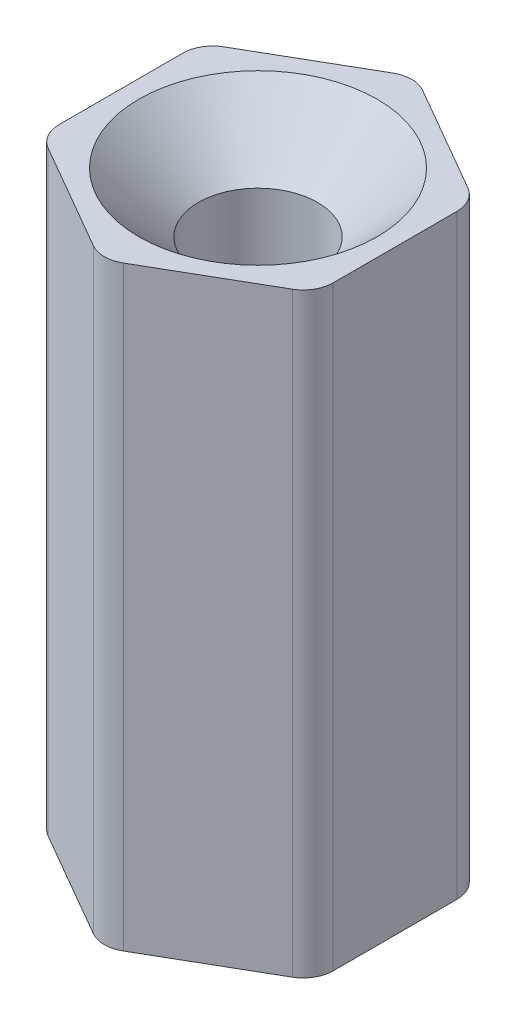
ISO-10303-21;
HEADER;
FILE_DESCRIPTION(('STEP AP214'),'2;1');
FILE_NAME('part.step','',(''),(''),'','','');
FILE_SCHEMA(('AUTOMOTIVE_DESIGN { 1 0 10303 214 1 1 1 1 }'));
ENDSEC;
DATA;
#1=APPLICATION_CONTEXT('core data for automotive mechanical design processes');
#2=APPLICATION_PROTOCOL_DEFINITION('international standard','automotive_design',2000,#1);
#3=PRODUCT_CONTEXT('',#1,'mechanical');
#4=PRODUCT('Part','Part','',(#3));
#5=PRODUCT_RELATED_PRODUCT_CATEGORY('part','',(#4));
#6=PRODUCT_DEFINITION_FORMATION('','',#4);
#7=PRODUCT_DEFINITION_CONTEXT('part definition',#1,'design');
#8=PRODUCT_DEFINITION('design','',#6,#7);
#9=PRODUCT_DEFINITION_SHAPE('','',#8);
#10=(LENGTH_UNIT() NAMED_UNIT(*) SI_UNIT(.MILLI.,.METRE.));
#11=(NAMED_UNIT(*) PLANE_ANGLE_UNIT() SI_UNIT($,.RADIAN.));
#12=(NAMED_UNIT(*) SI_UNIT($,.STERADIAN.) SOLID_ANGLE_UNIT());
#13=UNCERTAINTY_MEASURE_WITH_UNIT(LENGTH_MEASURE(1.E-05),#10,'distance_accuracy_value','');
#14=(GEOMETRIC_REPRESENTATION_CONTEXT(3) GLOBAL_UNCERTAINTY_ASSIGNED_CONTEXT((#13)) GLOBAL_UNIT_ASSIGNED_CONTEXT((#10,
#11,#12)) REPRESENTATION_CONTEXT('',''));
#15=CARTESIAN_POINT('',(0.,0.,0.));
#16=DIRECTION('',(0.,0.,1.));
#17=DIRECTION('',(1.,0.,0.));
#18=AXIS2_PLACEMENT_3D('',#15,#16,#17);
#19=CARTESIAN_POINT('',(2.29999999999999,10.,-1.32790561913617));
#20=DIRECTION('',(-0.499999999999995,0.,0.866025403784442));
#21=DIRECTION('',(0.866025403784442,0.,0.499999999999995));
#22=AXIS2_PLACEMENT_3D('',#19,#20,#21);
#23=PLANE('',#22);
#24=DIRECTION('',(-0.866025403784442,0.,-0.499999999999995));
#25=VECTOR('',#24,1.);
#26=CARTESIAN_POINT('',(2.29999999999999,0.,-1.32790561913617));
#27=LINE('',#26,#25);
#28=CARTESIAN_POINT('',(2.04999999999999,0.,-1.47224318643357));
#29=VERTEX_POINT('',#28);
#30=CARTESIAN_POINT('',(0.249999999999999,0.,-2.51147367097488));
#31=VERTEX_POINT('',#30);
#32=EDGE_CURVE('E212',#29,#31,#27,.T.);
#33=ORIENTED_EDGE('',*,*,#32,.T.);
#34=DIRECTION('',(0.,-1.,0.));
#35=VECTOR('',#34,1.);
#36=CARTESIAN_POINT('',(0.249999999999999,10.,-2.51147367097488));
#37=LINE('',#36,#35);
#38=CARTESIAN_POINT('',(0.249999999999999,10.,-2.51147367097488));
#39=VERTEX_POINT('',#38);
#40=EDGE_CURVE('E205',#31,#39,#37,.F.);
#41=ORIENTED_EDGE('',*,*,#40,.T.);
#42=DIRECTION('',(-0.866025403784442,0.,-0.499999999999995));
#43=VECTOR('',#42,1.);
#44=CARTESIAN_POINT('',(2.29999999999999,10.,-1.32790561913617));
#45=LINE('',#44,#43);
#46=CARTESIAN_POINT('',(2.04999999999999,10.,-1.47224318643357));
#47=VERTEX_POINT('',#46);
#48=EDGE_CURVE('E150',#47,#39,#45,.T.);
#49=ORIENTED_EDGE('',*,*,#48,.F.);
#50=DIRECTION('',(0.,-1.,0.));
#51=VECTOR('',#50,1.);
#52=CARTESIAN_POINT('',(2.04999999999999,10.,-1.47224318643357));
#53=LINE('',#52,#51);
#54=EDGE_CURVE('E202',#47,#29,#53,.T.);
#55=ORIENTED_EDGE('',*,*,#54,.T.);
#56=EDGE_LOOP('',(#33,#41,#49,#55));
#57=FACE_BOUND('',#56,.T.);
#58=ADVANCED_FACE('F33',(#57),#23,.F.);
#59=CARTESIAN_POINT('',(0.,10.,-2.65581123827228));
#60=DIRECTION('',(0.500000000000001,0.,0.866025403784438));
#61=DIRECTION('',(0.866025403784438,0.,-0.500000000000001));
#62=AXIS2_PLACEMENT_3D('',#59,#60,#61);
#63=PLANE('',#62);
#64=DIRECTION('',(-0.866025403784438,0.,0.500000000000001));
#65=VECTOR('',#64,1.);
#66=CARTESIAN_POINT('',(0.,0.,-2.65581123827228));
#67=LINE('',#66,#65);
#68=CARTESIAN_POINT('',(-0.249999999999998,0.,-2.51147367097488));
#69=VERTEX_POINT('',#68);
#70=CARTESIAN_POINT('',(-2.05000000000001,0.,-1.47224318643354));
#71=VERTEX_POINT('',#70);
#72=EDGE_CURVE('E236',#69,#71,#67,.T.);
#73=ORIENTED_EDGE('',*,*,#72,.T.);
#74=DIRECTION('',(0.,-1.,0.));
#75=VECTOR('',#74,1.);
#76=CARTESIAN_POINT('',(-2.05,10.,-1.47224318643354));
#77=LINE('',#76,#75);
#78=CARTESIAN_POINT('',(-2.05000000000001,10.,-1.47224318643354));
#79=VERTEX_POINT('',#78);
#80=EDGE_CURVE('E200',#71,#79,#77,.F.);
#81=ORIENTED_EDGE('',*,*,#80,.T.);
#82=DIRECTION('',(-0.866025403784438,0.,0.500000000000001));
#83=VECTOR('',#82,1.);
#84=CARTESIAN_POINT('',(0.,10.,-2.65581123827228));
#85=LINE('',#84,#83);
#86=CARTESIAN_POINT('',(-0.249999999999998,10.,-2.51147367097488));
#87=VERTEX_POINT('',#86);
#88=EDGE_CURVE('E222',#87,#79,#85,.T.);
#89=ORIENTED_EDGE('',*,*,#88,.F.);
#90=DIRECTION('',(0.,-1.,0.));
#91=VECTOR('',#90,1.);
#92=CARTESIAN_POINT('',(-0.249999999999998,10.,-2.51147367097488));
#93=LINE('',#92,#91);
#94=EDGE_CURVE('E197',#87,#69,#93,.T.);
#95=ORIENTED_EDGE('',*,*,#94,.T.);
#96=EDGE_LOOP('',(#73,#81,#89,#95));
#97=FACE_BOUND('',#96,.T.);
#98=ADVANCED_FACE('F260',(#97),#63,.F.);
#99=CARTESIAN_POINT('',(-2.30000000000001,10.,-1.32790561913614));
#100=DIRECTION('',(1.,0.,0.));
#101=DIRECTION('',(0.,0.,-1.));
#102=AXIS2_PLACEMENT_3D('',#99,#100,#101);
#103=PLANE('',#102);
#104=DIRECTION('',(0.,0.,1.));
#105=VECTOR('',#104,1.);
#106=CARTESIAN_POINT('',(-2.30000000000001,0.,-1.32790561913614));
#107=LINE('',#106,#105);
#108=CARTESIAN_POINT('',(-2.3,0.,-1.03923048454132));
#109=VERTEX_POINT('',#108);
#110=CARTESIAN_POINT('',(-2.3,0.,1.03923048454134));
#111=VERTEX_POINT('',#110);
#112=EDGE_CURVE('E152',#109,#111,#107,.T.);
#113=ORIENTED_EDGE('',*,*,#112,.T.);
#114=DIRECTION('',(0.,-1.,0.));
#115=VECTOR('',#114,1.);
#116=CARTESIAN_POINT('',(-2.3,10.,1.03923048454134));
#117=LINE('',#116,#115);
#118=CARTESIAN_POINT('',(-2.3,10.,1.03923048454134));
#119=VERTEX_POINT('',#118);
#120=EDGE_CURVE('E195',#111,#119,#117,.F.);
#121=ORIENTED_EDGE('',*,*,#120,.T.);
#122=DIRECTION('',(0.,0.,1.));
#123=VECTOR('',#122,1.);
#124=CARTESIAN_POINT('',(-2.30000000000001,10.,-1.32790561913614));
#125=LINE('',#124,#123);
#126=CARTESIAN_POINT('',(-2.3,10.,-1.03923048454132));
#127=VERTEX_POINT('',#126);
#128=EDGE_CURVE('E225',#127,#119,#125,.T.);
#129=ORIENTED_EDGE('',*,*,#128,.F.);
#130=DIRECTION('',(0.,-1.,0.));
#131=VECTOR('',#130,1.);
#132=CARTESIAN_POINT('',(-2.3,10.,-1.03923048454132));
#133=LINE('',#132,#131);
#134=EDGE_CURVE('E192',#127,#109,#133,.T.);
#135=ORIENTED_EDGE('',*,*,#134,.T.);
#136=EDGE_LOOP('',(#113,#121,#129,#135));
#137=FACE_BOUND('',#136,.T.);
#138=ADVANCED_FACE('F242',(#137),#103,.F.);
#139=CARTESIAN_POINT('',(-2.3,10.,1.32790561913615));
#140=DIRECTION('',(0.499999999999995,0.,-0.866025403784442));
#141=DIRECTION('',(-0.866025403784442,0.,-0.499999999999995));
#142=AXIS2_PLACEMENT_3D('',#139,#140,#141);
#143=PLANE('',#142);
#144=DIRECTION('',(0.866025403784442,0.,0.499999999999995));
#145=VECTOR('',#144,1.);
#146=CARTESIAN_POINT('',(-2.3,0.,1.32790561913615));
#147=LINE('',#146,#145);
#148=CARTESIAN_POINT('',(-2.04999999999999,0.,1.47224318643356));
#149=VERTEX_POINT('',#148);
#150=CARTESIAN_POINT('',(-0.249999999999982,0.,2.51147367097488));
#151=VERTEX_POINT('',#150);
#152=EDGE_CURVE('E148',#149,#151,#147,.T.);
#153=ORIENTED_EDGE('',*,*,#152,.T.);
#154=DIRECTION('',(0.,-1.,0.));
#155=VECTOR('',#154,1.);
#156=CARTESIAN_POINT('',(-0.249999999999983,10.,2.51147367097488));
#157=LINE('',#156,#155);
#158=CARTESIAN_POINT('',(-0.249999999999982,10.,2.51147367097488));
#159=VERTEX_POINT('',#158);
#160=EDGE_CURVE('E127',#151,#159,#157,.F.);
#161=ORIENTED_EDGE('',*,*,#160,.T.);
#162=DIRECTION('',(0.866025403784442,0.,0.499999999999995));
#163=VECTOR('',#162,1.);
#164=CARTESIAN_POINT('',(-2.3,10.,1.32790561913615));
#165=LINE('',#164,#163);
#166=CARTESIAN_POINT('',(-2.04999999999999,10.,1.47224318643356));
#167=VERTEX_POINT('',#166);
#168=EDGE_CURVE('E230',#167,#159,#165,.T.);
#169=ORIENTED_EDGE('',*,*,#168,.F.);
#170=DIRECTION('',(0.,-1.,0.));
#171=VECTOR('',#170,1.);
#172=CARTESIAN_POINT('',(-2.04999999999999,10.,1.47224318643356));
#173=LINE('',#172,#171);
#174=EDGE_CURVE('E132',#167,#149,#173,.T.);
#175=ORIENTED_EDGE('',*,*,#174,.T.);
#176=EDGE_LOOP('',(#153,#161,#169,#175));
#177=FACE_BOUND('',#176,.T.);
#178=ADVANCED_FACE('F252',(#177),#143,.F.);
#179=CARTESIAN_POINT('',(0.,10.,2.65581123827228));
#180=DIRECTION('',(-0.500000000000007,0.,-0.866025403784434));
#181=DIRECTION('',(-0.866025403784435,0.,0.500000000000007));
#182=AXIS2_PLACEMENT_3D('',#179,#180,#181);
#183=PLANE('',#182);
#184=DIRECTION('',(0.866025403784435,0.,-0.500000000000007));
#185=VECTOR('',#184,1.);
#186=CARTESIAN_POINT('',(0.,10.,2.65581123827228));
#187=LINE('',#186,#185);
#188=CARTESIAN_POINT('',(0.250000000000018,10.,2.51147367097487));
#189=VERTEX_POINT('',#188);
#190=CARTESIAN_POINT('',(2.05000000000001,10.,1.47224318643353));
#191=VERTEX_POINT('',#190);
#192=EDGE_CURVE('E141',#189,#191,#187,.T.);
#193=ORIENTED_EDGE('',*,*,#192,.F.);
#194=DIRECTION('',(0.,-1.,0.));
#195=VECTOR('',#194,1.);
#196=CARTESIAN_POINT('',(0.250000000000018,10.,2.51147367097487));
#197=LINE('',#196,#195);
#198=CARTESIAN_POINT('',(0.250000000000018,0.,2.51147367097487));
#199=VERTEX_POINT('',#198);
#200=EDGE_CURVE('E126',#189,#199,#197,.T.);
#201=ORIENTED_EDGE('',*,*,#200,.T.);
#202=DIRECTION('',(0.866025403784435,0.,-0.500000000000007));
#203=VECTOR('',#202,1.);
#204=CARTESIAN_POINT('',(0.,0.,2.65581123827228));
#205=LINE('',#204,#203);
#206=CARTESIAN_POINT('',(2.05000000000001,0.,1.47224318643353));
#207=VERTEX_POINT('',#206);
#208=EDGE_CURVE('E139',#199,#207,#205,.T.);
#209=ORIENTED_EDGE('',*,*,#208,.T.);
#210=DIRECTION('',(0.,-1.,0.));
#211=VECTOR('',#210,1.);
#212=CARTESIAN_POINT('',(2.05000000000001,10.,1.47224318643353));
#213=LINE('',#212,#211);
#214=EDGE_CURVE('E143',#207,#191,#213,.F.);
#215=ORIENTED_EDGE('',*,*,#214,.T.);
#216=EDGE_LOOP('',(#193,#201,#209,#215));
#217=FACE_BOUND('',#216,.T.);
#218=ADVANCED_FACE('F138',(#217),#183,.F.);
#219=CARTESIAN_POINT('',(2.30000000000001,10.,1.32790561913612));
#220=DIRECTION('',(-1.,0.,0.));
#221=DIRECTION('',(0.,0.,1.));
#222=AXIS2_PLACEMENT_3D('',#219,#220,#221);
#223=PLANE('',#222);
#224=DIRECTION('',(0.,0.,-1.));
#225=VECTOR('',#224,1.);
#226=CARTESIAN_POINT('',(2.30000000000001,0.,1.32790561913612));
#227=LINE('',#226,#225);
#228=CARTESIAN_POINT('',(2.30000000000001,0.,1.03923048454131));
#229=VERTEX_POINT('',#228);
#230=CARTESIAN_POINT('',(2.29999999999999,0.,-1.03923048454136));
#231=VERTEX_POINT('',#230);
#232=EDGE_CURVE('E147',#229,#231,#227,.T.);
#233=ORIENTED_EDGE('',*,*,#232,.T.);
#234=DIRECTION('',(0.,-1.,0.));
#235=VECTOR('',#234,1.);
#236=CARTESIAN_POINT('',(2.29999999999999,10.,-1.03923048454136));
#237=LINE('',#236,#235);
#238=CARTESIAN_POINT('',(2.29999999999999,10.,-1.03923048454136));
#239=VERTEX_POINT('',#238);
#240=EDGE_CURVE('E11',#231,#239,#237,.F.);
#241=ORIENTED_EDGE('',*,*,#240,.T.);
#242=DIRECTION('',(0.,0.,-1.));
#243=VECTOR('',#242,1.);
#244=CARTESIAN_POINT('',(2.30000000000001,10.,1.32790561913612));
#245=LINE('',#244,#243);
#246=CARTESIAN_POINT('',(2.30000000000001,10.,1.03923048454131));
#247=VERTEX_POINT('',#246);
#248=EDGE_CURVE('E160',#247,#239,#245,.T.);
#249=ORIENTED_EDGE('',*,*,#248,.F.);
#250=DIRECTION('',(0.,-1.,0.));
#251=VECTOR('',#250,1.);
#252=CARTESIAN_POINT('',(2.30000000000001,10.,1.03923048454131));
#253=LINE('',#252,#251);
#254=EDGE_CURVE('E41',#247,#229,#253,.T.);
#255=ORIENTED_EDGE('',*,*,#254,.T.);
#256=EDGE_LOOP('',(#233,#241,#249,#255));
#257=FACE_BOUND('',#256,.T.);
#258=ADVANCED_FACE('F208',(#257),#223,.F.);
#259=CARTESIAN_POINT('',(0.,10.,0.));
#260=DIRECTION('',(0.,1.,0.));
#261=DIRECTION('',(0.,0.,1.));
#262=AXIS2_PLACEMENT_3D('',#259,#260,#261);
#263=PLANE('',#262);
#264=CARTESIAN_POINT('',(0.,10.,0.));
#265=DIRECTION('',(0.,1.,0.));
#266=DIRECTION('',(0.,0.,1.));
#267=AXIS2_PLACEMENT_3D('',#264,#265,#266);
#268=CIRCLE('',#267,2.);
#269=CARTESIAN_POINT('',(0.,10.,2.));
#270=VERTEX_POINT('',#269);
#271=EDGE_CURVE('E166',#270,#270,#268,.F.);
#272=ORIENTED_EDGE('',*,*,#271,.T.);
#273=EDGE_LOOP('',(#272));
#274=FACE_BOUND('',#273,.T.);
#275=ORIENTED_EDGE('',*,*,#168,.T.);
#276=CARTESIAN_POINT('',(0.,10.,2.07846096908265));
#277=DIRECTION('',(0.,1.,0.));
#278=DIRECTION('',(0.,0.,1.));
#279=AXIS2_PLACEMENT_3D('',#276,#277,#278);
#280=CIRCLE('',#279,0.5);
#281=EDGE_CURVE('E190',#159,#189,#280,.T.);
#282=ORIENTED_EDGE('',*,*,#281,.T.);
#283=ORIENTED_EDGE('',*,*,#192,.T.);
#284=CARTESIAN_POINT('',(1.80000000000001,10.,1.03923048454131));
#285=DIRECTION('',(0.,1.,0.));
#286=DIRECTION('',(0.,0.,1.));
#287=AXIS2_PLACEMENT_3D('',#284,#285,#286);
#288=CIRCLE('',#287,0.5);
#289=EDGE_CURVE('E53',#191,#247,#288,.T.);
#290=ORIENTED_EDGE('',*,*,#289,.T.);
#291=ORIENTED_EDGE('',*,*,#248,.T.);
#292=CARTESIAN_POINT('',(1.79999999999999,10.,-1.03923048454135));
#293=DIRECTION('',(0.,1.,0.));
#294=DIRECTION('',(0.,0.,1.));
#295=AXIS2_PLACEMENT_3D('',#292,#293,#294);
#296=CIRCLE('',#295,0.5);
#297=EDGE_CURVE('E182',#239,#47,#296,.T.);
#298=ORIENTED_EDGE('',*,*,#297,.T.);
#299=ORIENTED_EDGE('',*,*,#48,.T.);
#300=CARTESIAN_POINT('',(0.,10.,-2.07846096908266));
#301=DIRECTION('',(0.,1.,0.));
#302=DIRECTION('',(0.,0.,1.));
#303=AXIS2_PLACEMENT_3D('',#300,#301,#302);
#304=CIRCLE('',#303,0.5);
#305=EDGE_CURVE('E184',#39,#87,#304,.T.);
#306=ORIENTED_EDGE('',*,*,#305,.T.);
#307=ORIENTED_EDGE('',*,*,#88,.T.);
#308=CARTESIAN_POINT('',(-1.8,10.,-1.03923048454132));
#309=DIRECTION('',(0.,1.,0.));
#310=DIRECTION('',(0.,0.,1.));
#311=AXIS2_PLACEMENT_3D('',#308,#309,#310);
#312=CIRCLE('',#311,0.5);
#313=EDGE_CURVE('E186',#79,#127,#312,.T.);
#314=ORIENTED_EDGE('',*,*,#313,.T.);
#315=ORIENTED_EDGE('',*,*,#128,.T.);
#316=CARTESIAN_POINT('',(-1.8,10.,1.03923048454134));
#317=DIRECTION('',(0.,1.,0.));
#318=DIRECTION('',(0.,0.,1.));
#319=AXIS2_PLACEMENT_3D('',#316,#317,#318);
#320=CIRCLE('',#319,0.5);
#321=EDGE_CURVE('E188',#119,#167,#320,.T.);
#322=ORIENTED_EDGE('',*,*,#321,.T.);
#323=EDGE_LOOP('',(#275,#282,#283,#290,#291,#298,#299,#306,#307,#314,#315,#322));
#324=FACE_BOUND('',#323,.T.);
#325=ADVANCED_FACE('F250',(#274,#324),#263,.T.);
#326=CARTESIAN_POINT('',(0.,0.,0.));
#327=DIRECTION('',(0.,1.,0.));
#328=DIRECTION('',(0.,0.,1.));
#329=AXIS2_PLACEMENT_3D('',#326,#327,#328);
#330=PLANE('',#329);
#331=CARTESIAN_POINT('',(0.,0.,0.));
#332=DIRECTION('',(0.,1.,0.));
#333=DIRECTION('',(0.,0.,1.));
#334=AXIS2_PLACEMENT_3D('',#331,#332,#333);
#335=CIRCLE('',#334,2.);
#336=CARTESIAN_POINT('',(0.,0.,2.));
#337=VERTEX_POINT('',#336);
#338=EDGE_CURVE('E156',#337,#337,#335,.T.);
#339=ORIENTED_EDGE('',*,*,#338,.T.);
#340=EDGE_LOOP('',(#339));
#341=FACE_BOUND('',#340,.T.);
#342=ORIENTED_EDGE('',*,*,#208,.F.);
#343=CARTESIAN_POINT('',(0.,0.,2.07846096908265));
#344=DIRECTION('',(0.,1.,0.));
#345=DIRECTION('',(0.,0.,1.));
#346=AXIS2_PLACEMENT_3D('',#343,#344,#345);
#347=CIRCLE('',#346,0.5);
#348=EDGE_CURVE('E122',#199,#151,#347,.F.);
#349=ORIENTED_EDGE('',*,*,#348,.T.);
#350=ORIENTED_EDGE('',*,*,#152,.F.);
#351=CARTESIAN_POINT('',(-1.8,0.,1.03923048454134));
#352=DIRECTION('',(0.,1.,0.));
#353=DIRECTION('',(0.,0.,1.));
#354=AXIS2_PLACEMENT_3D('',#351,#352,#353);
#355=CIRCLE('',#354,0.5);
#356=EDGE_CURVE('E133',#149,#111,#355,.F.);
#357=ORIENTED_EDGE('',*,*,#356,.T.);
#358=ORIENTED_EDGE('',*,*,#112,.F.);
#359=CARTESIAN_POINT('',(-1.8,0.,-1.03923048454132));
#360=DIRECTION('',(0.,1.,0.));
#361=DIRECTION('',(0.,0.,1.));
#362=AXIS2_PLACEMENT_3D('',#359,#360,#361);
#363=CIRCLE('',#362,0.5);
#364=EDGE_CURVE('E175',#109,#71,#363,.F.);
#365=ORIENTED_EDGE('',*,*,#364,.T.);
#366=ORIENTED_EDGE('',*,*,#72,.F.);
#367=CARTESIAN_POINT('',(0.,0.,-2.07846096908266));
#368=DIRECTION('',(0.,1.,0.));
#369=DIRECTION('',(0.,0.,1.));
#370=AXIS2_PLACEMENT_3D('',#367,#368,#369);
#371=CIRCLE('',#370,0.5);
#372=EDGE_CURVE('E173',#69,#31,#371,.F.);
#373=ORIENTED_EDGE('',*,*,#372,.T.);
#374=ORIENTED_EDGE('',*,*,#32,.F.);
#375=CARTESIAN_POINT('',(1.79999999999999,0.,-1.03923048454135));
#376=DIRECTION('',(0.,1.,0.));
#377=DIRECTION('',(0.,0.,1.));
#378=AXIS2_PLACEMENT_3D('',#375,#376,#377);
#379=CIRCLE('',#378,0.5);
#380=EDGE_CURVE('E171',#29,#231,#379,.F.);
#381=ORIENTED_EDGE('',*,*,#380,.T.);
#382=ORIENTED_EDGE('',*,*,#232,.F.);
#383=CARTESIAN_POINT('',(1.80000000000001,0.,1.03923048454131));
#384=DIRECTION('',(0.,1.,0.));
#385=DIRECTION('',(0.,0.,1.));
#386=AXIS2_PLACEMENT_3D('',#383,#384,#385);
#387=CIRCLE('',#386,0.5);
#388=EDGE_CURVE('E142',#229,#207,#387,.F.);
#389=ORIENTED_EDGE('',*,*,#388,.T.);
#390=EDGE_LOOP('',(#342,#349,#350,#357,#358,#365,#366,#373,#374,#381,#382,#389));
#391=FACE_BOUND('',#390,.T.);
#392=ADVANCED_FACE('F145',(#341,#391),#330,.F.);
#393=CARTESIAN_POINT('',(0.,0.,0.));
#394=DIRECTION('',(0.,1.,0.));
#395=DIRECTION('',(0.,0.,1.));
#396=AXIS2_PLACEMENT_3D('',#393,#394,#395);
#397=CYLINDRICAL_SURFACE('',#396,1.);
#398=CARTESIAN_POINT('',(0.,1.,0.));
#399=DIRECTION('',(0.,1.,0.));
#400=DIRECTION('',(0.,0.,1.));
#401=AXIS2_PLACEMENT_3D('',#398,#399,#400);
#402=CIRCLE('',#401,1.);
#403=CARTESIAN_POINT('',(0.,1.,1.));
#404=VERTEX_POINT('',#403);
#405=EDGE_CURVE('E163',#404,#404,#402,.F.);
#406=ORIENTED_EDGE('',*,*,#405,.T.);
#407=EDGE_LOOP('',(#406));
#408=FACE_BOUND('',#407,.T.);
#409=CARTESIAN_POINT('',(0.,9.,0.));
#410=DIRECTION('',(0.,1.,0.));
#411=DIRECTION('',(0.,0.,1.));
#412=AXIS2_PLACEMENT_3D('',#409,#410,#411);
#413=CIRCLE('',#412,1.);
#414=CARTESIAN_POINT('',(0.,9.,1.));
#415=VERTEX_POINT('',#414);
#416=EDGE_CURVE('E159',#415,#415,#413,.T.);
#417=ORIENTED_EDGE('',*,*,#416,.T.);
#418=EDGE_LOOP('',(#417));
#419=FACE_BOUND('',#418,.T.);
#420=ADVANCED_FACE('F274',(#408,#419),#397,.F.);
#421=CARTESIAN_POINT('',(0.,0.,0.));
#422=DIRECTION('',(0.,-1.,0.));
#423=DIRECTION('',(0.,0.,-1.));
#424=AXIS2_PLACEMENT_3D('',#421,#422,#423);
#425=CONICAL_SURFACE('',#424,2.,0.785398163397447);
#426=ORIENTED_EDGE('',*,*,#405,.F.);
#427=EDGE_LOOP('',(#426));
#428=FACE_BOUND('',#427,.T.);
#429=ORIENTED_EDGE('',*,*,#338,.F.);
#430=EDGE_LOOP('',(#429));
#431=FACE_BOUND('',#430,.T.);
#432=ADVANCED_FACE('F270',(#428,#431),#425,.F.);
#433=CARTESIAN_POINT('',(0.,9.,0.));
#434=DIRECTION('',(0.,1.,0.));
#435=DIRECTION('',(0.,0.,1.));
#436=AXIS2_PLACEMENT_3D('',#433,#434,#435);
#437=CONICAL_SURFACE('',#436,1.,0.78539816339745);
#438=ORIENTED_EDGE('',*,*,#271,.F.);
#439=EDGE_LOOP('',(#438));
#440=FACE_BOUND('',#439,.T.);
#441=ORIENTED_EDGE('',*,*,#416,.F.);
#442=EDGE_LOOP('',(#441));
#443=FACE_BOUND('',#442,.T.);
#444=ADVANCED_FACE('F273',(#440,#443),#437,.F.);
#445=CARTESIAN_POINT('',(0.,10.,2.07846096908265));
#446=DIRECTION('',(0.,-1.,0.));
#447=DIRECTION('',(0.,0.,-1.));
#448=AXIS2_PLACEMENT_3D('',#445,#446,#447);
#449=CYLINDRICAL_SURFACE('',#448,0.5);
#450=ORIENTED_EDGE('',*,*,#281,.F.);
#451=ORIENTED_EDGE('',*,*,#160,.F.);
#452=ORIENTED_EDGE('',*,*,#348,.F.);
#453=ORIENTED_EDGE('',*,*,#200,.F.);
#454=EDGE_LOOP('',(#450,#451,#452,#453));
#455=FACE_BOUND('',#454,.T.);
#456=ADVANCED_FACE('F125',(#455),#449,.T.);
#457=CARTESIAN_POINT('',(-1.8,10.,1.03923048454134));
#458=DIRECTION('',(0.,-1.,0.));
#459=DIRECTION('',(0.,0.,-1.));
#460=AXIS2_PLACEMENT_3D('',#457,#458,#459);
#461=CYLINDRICAL_SURFACE('',#460,0.5);
#462=ORIENTED_EDGE('',*,*,#321,.F.);
#463=ORIENTED_EDGE('',*,*,#120,.F.);
#464=ORIENTED_EDGE('',*,*,#356,.F.);
#465=ORIENTED_EDGE('',*,*,#174,.F.);
#466=EDGE_LOOP('',(#462,#463,#464,#465));
#467=FACE_BOUND('',#466,.T.);
#468=ADVANCED_FACE('F247',(#467),#461,.T.);
#469=CARTESIAN_POINT('',(-1.8,10.,-1.03923048454132));
#470=DIRECTION('',(0.,-1.,0.));
#471=DIRECTION('',(0.,0.,-1.));
#472=AXIS2_PLACEMENT_3D('',#469,#470,#471);
#473=CYLINDRICAL_SURFACE('',#472,0.5);
#474=ORIENTED_EDGE('',*,*,#313,.F.);
#475=ORIENTED_EDGE('',*,*,#80,.F.);
#476=ORIENTED_EDGE('',*,*,#364,.F.);
#477=ORIENTED_EDGE('',*,*,#134,.F.);
#478=EDGE_LOOP('',(#474,#475,#476,#477));
#479=FACE_BOUND('',#478,.T.);
#480=ADVANCED_FACE('F283',(#479),#473,.T.);
#481=CARTESIAN_POINT('',(0.,10.,-2.07846096908266));
#482=DIRECTION('',(0.,-1.,0.));
#483=DIRECTION('',(0.,0.,-1.));
#484=AXIS2_PLACEMENT_3D('',#481,#482,#483);
#485=CYLINDRICAL_SURFACE('',#484,0.5);
#486=ORIENTED_EDGE('',*,*,#305,.F.);
#487=ORIENTED_EDGE('',*,*,#40,.F.);
#488=ORIENTED_EDGE('',*,*,#372,.F.);
#489=ORIENTED_EDGE('',*,*,#94,.F.);
#490=EDGE_LOOP('',(#486,#487,#488,#489));
#491=FACE_BOUND('',#490,.T.);
#492=ADVANCED_FACE('F286',(#491),#485,.T.);
#493=CARTESIAN_POINT('',(1.79999999999999,10.,-1.03923048454135));
#494=DIRECTION('',(0.,-1.,0.));
#495=DIRECTION('',(0.,0.,-1.));
#496=AXIS2_PLACEMENT_3D('',#493,#494,#495);
#497=CYLINDRICAL_SURFACE('',#496,0.5);
#498=ORIENTED_EDGE('',*,*,#297,.F.);
#499=ORIENTED_EDGE('',*,*,#240,.F.);
#500=ORIENTED_EDGE('',*,*,#380,.F.);
#501=ORIENTED_EDGE('',*,*,#54,.F.);
#502=EDGE_LOOP('',(#498,#499,#500,#501));
#503=FACE_BOUND('',#502,.T.);
#504=ADVANCED_FACE('F216',(#503),#497,.T.);
#505=CARTESIAN_POINT('',(1.80000000000001,10.,1.03923048454131));
#506=DIRECTION('',(0.,-1.,0.));
#507=DIRECTION('',(0.,0.,-1.));
#508=AXIS2_PLACEMENT_3D('',#505,#506,#507);
#509=CYLINDRICAL_SURFACE('',#508,0.5);
#510=ORIENTED_EDGE('',*,*,#289,.F.);
#511=ORIENTED_EDGE('',*,*,#214,.F.);
#512=ORIENTED_EDGE('',*,*,#388,.F.);
#513=ORIENTED_EDGE('',*,*,#254,.F.);
#514=EDGE_LOOP('',(#510,#511,#512,#513));
#515=FACE_BOUND('',#514,.T.);
#516=ADVANCED_FACE('F35',(#515),#509,.T.);
#517=CLOSED_SHELL('',(#58,#98,#138,#178,#218,#258,#325,#392,#420,#432,#444,#456,#468,#480,#492,
#504,#516));
#518=MANIFOLD_SOLID_BREP('B2',#517);
#519=ADVANCED_BREP_SHAPE_REPRESENTATION('',(#18,#518),#14);
#520=SHAPE_DEFINITION_REPRESENTATION(#9,#519);
ENDSEC;
END-ISO-10303-21;
